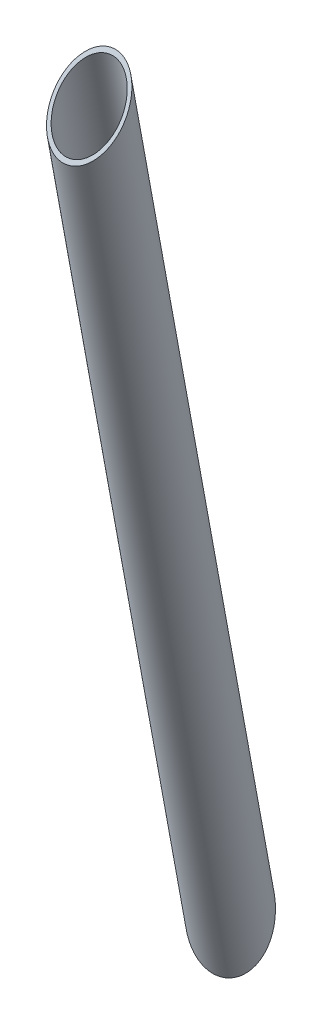
ISO-10303-21;
HEADER;
FILE_DESCRIPTION(('STEP AP214'),'2;1');
FILE_NAME('part.step','',(''),(''),'','','');
FILE_SCHEMA(('AUTOMOTIVE_DESIGN { 1 0 10303 214 1 1 1 1 }'));
ENDSEC;
DATA;
#1=APPLICATION_CONTEXT('core data for automotive mechanical design processes');
#2=APPLICATION_PROTOCOL_DEFINITION('international standard','automotive_design',2000,#1);
#3=PRODUCT_CONTEXT('',#1,'mechanical');
#4=PRODUCT('Part','Part','',(#3));
#5=PRODUCT_RELATED_PRODUCT_CATEGORY('part','',(#4));
#6=PRODUCT_DEFINITION_FORMATION('','',#4);
#7=PRODUCT_DEFINITION_CONTEXT('part definition',#1,'design');
#8=PRODUCT_DEFINITION('design','',#6,#7);
#9=PRODUCT_DEFINITION_SHAPE('','',#8);
#10=(LENGTH_UNIT() NAMED_UNIT(*) SI_UNIT(.MILLI.,.METRE.));
#11=(NAMED_UNIT(*) PLANE_ANGLE_UNIT() SI_UNIT($,.RADIAN.));
#12=(NAMED_UNIT(*) SI_UNIT($,.STERADIAN.) SOLID_ANGLE_UNIT());
#13=UNCERTAINTY_MEASURE_WITH_UNIT(LENGTH_MEASURE(1.E-05),#10,'distance_accuracy_value','');
#14=(GEOMETRIC_REPRESENTATION_CONTEXT(3) GLOBAL_UNCERTAINTY_ASSIGNED_CONTEXT((#13)) GLOBAL_UNIT_ASSIGNED_CONTEXT((#10,
#11,#12)) REPRESENTATION_CONTEXT('',''));
#15=CARTESIAN_POINT('',(0.,0.,0.));
#16=DIRECTION('',(0.,0.,1.));
#17=DIRECTION('',(1.,0.,0.));
#18=AXIS2_PLACEMENT_3D('',#15,#16,#17);
#19=CARTESIAN_POINT('',(325.,320.,-1580.));
#20=DIRECTION('',(-0.214351342090107,-0.914565726251124,-0.342962147344171));
#21=DIRECTION('',(0.,0.351123441588391,-0.936329177569045));
#22=AXIS2_PLACEMENT_3D('',#19,#20,#21);
#23=CYLINDRICAL_SURFACE('',#22,9.79999999999998);
#24=CARTESIAN_POINT('',(325.,320.,-1580.));
#25=DIRECTION('',(0.00416950723616233,0.393939167319851,0.919127057408686));
#26=DIRECTION('',(-0.2871987901008,-0.87994037819309,0.37844654284329));
#27=AXIS2_PLACEMENT_3D('',#24,#25,#26);
#28=ELLIPSE('',#27,14.4884086128331,9.79999999999998);
#29=CARTESIAN_POINT('',(320.838946575908,307.251064245808,-1574.51691184917));
#30=VERTEX_POINT('',#29);
#31=EDGE_CURVE('E53',#30,#30,#28,.T.);
#32=ORIENTED_EDGE('',*,*,#31,.T.);
#33=EDGE_LOOP('',(#32));
#34=FACE_BOUND('',#33,.T.);
#35=CARTESIAN_POINT('',(246.393439859568,-15.3879899325107,-1705.77049622469));
#36=DIRECTION('',(-0.490298311522755,-0.291983203687916,-0.821190218208958));
#37=DIRECTION('',(0.140336447675245,-0.956366902675742,0.256257739239816));
#38=AXIS2_PLACEMENT_3D('',#35,#36,#37);
#39=ELLIPSE('',#38,14.9899561378574,9.79999999999998);
#40=CARTESIAN_POINT('',(248.497077054762,-29.7238878553186,-1701.9292039535));
#41=VERTEX_POINT('',#40);
#42=EDGE_CURVE('E43',#41,#41,#39,.T.);
#43=ORIENTED_EDGE('',*,*,#42,.T.);
#44=EDGE_LOOP('',(#43));
#45=FACE_BOUND('',#44,.T.);
#46=ADVANCED_FACE('F39',(#34,#45),#23,.F.);
#47=CARTESIAN_POINT('',(325.,320.,-1580.));
#48=DIRECTION('',(-0.214351342090107,-0.914565726251124,-0.342962147344171));
#49=DIRECTION('',(0.,0.351123441588391,-0.936329177569045));
#50=AXIS2_PLACEMENT_3D('',#47,#48,#49);
#51=CYLINDRICAL_SURFACE('',#50,11.);
#52=CARTESIAN_POINT('',(325.,320.,-1580.));
#53=DIRECTION('',(0.00416950723616233,0.393939167319851,0.919127057408686));
#54=DIRECTION('',(-0.2871987901008,-0.87994037819309,0.37844654284329));
#55=AXIS2_PLACEMENT_3D('',#52,#53,#54);
#56=ELLIPSE('',#55,16.2624994633842,11.);
#57=CARTESIAN_POINT('',(320.329429830101,305.689970071825,-1573.84551330009));
#58=VERTEX_POINT('',#57);
#59=EDGE_CURVE('E47',#58,#58,#56,.T.);
#60=ORIENTED_EDGE('',*,*,#59,.F.);
#61=EDGE_LOOP('',(#60));
#62=FACE_BOUND('',#61,.T.);
#63=CARTESIAN_POINT('',(246.393439859568,-15.3879899325107,-1705.77049622469));
#64=DIRECTION('',(-0.490298311522755,-0.291983203687916,-0.821190218208958));
#65=DIRECTION('',(0.140336447675245,-0.956366902675742,0.256257739239816));
#66=AXIS2_PLACEMENT_3D('',#63,#64,#65);
#67=ELLIPSE('',#66,16.8254609710644,11.);
#68=CARTESIAN_POINT('',(248.754665282745,-31.4793039274992,-1701.45884163458));
#69=VERTEX_POINT('',#68);
#70=EDGE_CURVE('E10',#69,#69,#67,.T.);
#71=ORIENTED_EDGE('',*,*,#70,.F.);
#72=EDGE_LOOP('',(#71));
#73=FACE_BOUND('',#72,.T.);
#74=ADVANCED_FACE('F67',(#62,#73),#51,.T.);
#75=CARTESIAN_POINT('',(325.,320.,-1580.));
#76=DIRECTION('',(0.00416950723616233,0.393939167319851,0.919127057408686));
#77=DIRECTION('',(0.,-0.919135046928569,0.393942591639465));
#78=AXIS2_PLACEMENT_3D('',#75,#76,#77);
#79=PLANE('',#78);
#80=ORIENTED_EDGE('',*,*,#31,.F.);
#81=EDGE_LOOP('',(#80));
#82=FACE_BOUND('',#81,.T.);
#83=ORIENTED_EDGE('',*,*,#59,.T.);
#84=EDGE_LOOP('',(#83));
#85=FACE_BOUND('',#84,.T.);
#86=ADVANCED_FACE('F62',(#82,#85),#79,.T.);
#87=CARTESIAN_POINT('',(254.068721686111,-3.32621324708995,-1714.64178299511));
#88=DIRECTION('',(-0.490298311522755,-0.291983203687916,-0.821190218208958));
#89=DIRECTION('',(-0.858605277115121,0.,0.512637277331708));
#90=AXIS2_PLACEMENT_3D('',#87,#88,#89);
#91=PLANE('',#90);
#92=ORIENTED_EDGE('',*,*,#42,.F.);
#93=EDGE_LOOP('',(#92));
#94=FACE_BOUND('',#93,.T.);
#95=ORIENTED_EDGE('',*,*,#70,.T.);
#96=EDGE_LOOP('',(#95));
#97=FACE_BOUND('',#96,.T.);
#98=ADVANCED_FACE('F41',(#94,#97),#91,.T.);
#99=CLOSED_SHELL('',(#46,#74,#86,#98));
#100=MANIFOLD_SOLID_BREP('B2',#99);
#101=ADVANCED_BREP_SHAPE_REPRESENTATION('',(#18,#100),#14);
#102=SHAPE_DEFINITION_REPRESENTATION(#9,#101);
ENDSEC;
END-ISO-10303-21;
